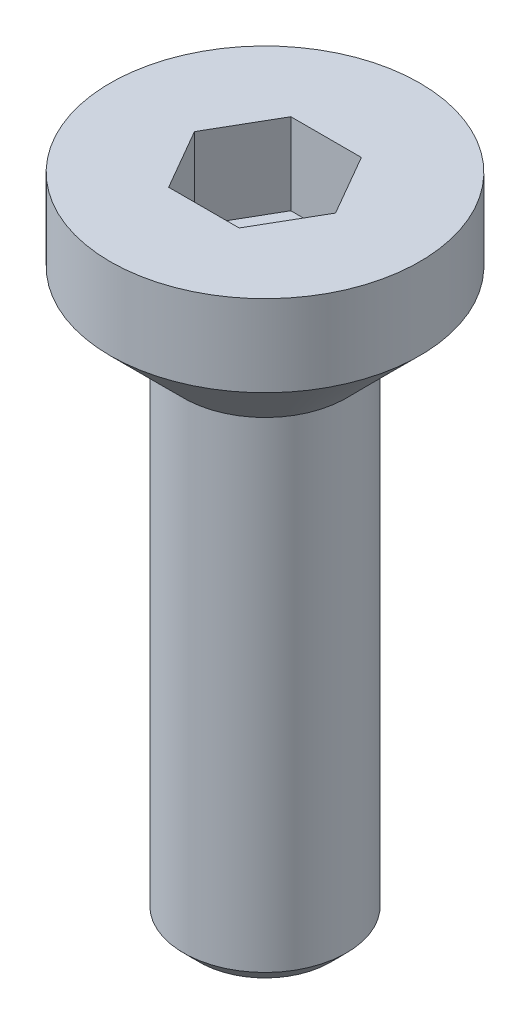
ISO-10303-21;
HEADER;
FILE_DESCRIPTION(('STEP AP214'),'2;1');
FILE_NAME('part.step','',(''),(''),'','','');
FILE_SCHEMA(('AUTOMOTIVE_DESIGN { 1 0 10303 214 1 1 1 1 }'));
ENDSEC;
DATA;
#1=APPLICATION_CONTEXT('core data for automotive mechanical design processes');
#2=APPLICATION_PROTOCOL_DEFINITION('international standard','automotive_design',2000,#1);
#3=PRODUCT_CONTEXT('',#1,'mechanical');
#4=PRODUCT('Part','Part','',(#3));
#5=PRODUCT_RELATED_PRODUCT_CATEGORY('part','',(#4));
#6=PRODUCT_DEFINITION_FORMATION('','',#4);
#7=PRODUCT_DEFINITION_CONTEXT('part definition',#1,'design');
#8=PRODUCT_DEFINITION('design','',#6,#7);
#9=PRODUCT_DEFINITION_SHAPE('','',#8);
#10=(LENGTH_UNIT() NAMED_UNIT(*) SI_UNIT(.MILLI.,.METRE.));
#11=(NAMED_UNIT(*) PLANE_ANGLE_UNIT() SI_UNIT($,.RADIAN.));
#12=(NAMED_UNIT(*) SI_UNIT($,.STERADIAN.) SOLID_ANGLE_UNIT());
#13=UNCERTAINTY_MEASURE_WITH_UNIT(LENGTH_MEASURE(1.E-05),#10,'distance_accuracy_value','');
#14=(GEOMETRIC_REPRESENTATION_CONTEXT(3) GLOBAL_UNCERTAINTY_ASSIGNED_CONTEXT((#13)) GLOBAL_UNIT_ASSIGNED_CONTEXT((#10,
#11,#12)) REPRESENTATION_CONTEXT('',''));
#15=CARTESIAN_POINT('',(0.,0.,0.));
#16=DIRECTION('',(0.,0.,1.));
#17=DIRECTION('',(1.,0.,0.));
#18=AXIS2_PLACEMENT_3D('',#15,#16,#17);
#19=CARTESIAN_POINT('',(0.,3.32965981119297,0.));
#20=DIRECTION('',(0.,-1.,0.));
#21=DIRECTION('',(0.,0.,-1.));
#22=AXIS2_PLACEMENT_3D('',#19,#20,#21);
#23=PLANE('',#22);
#24=DIRECTION('',(1.,0.,0.));
#25=VECTOR('',#24,1.);
#26=CARTESIAN_POINT('',(-0.43301270189222,3.32965981119297,0.75));
#27=LINE('',#26,#25);
#28=CARTESIAN_POINT('',(-0.43301270189222,3.32965981119297,0.75));
#29=VERTEX_POINT('',#28);
#30=CARTESIAN_POINT('',(0.433012701892219,3.32965981119297,0.75));
#31=VERTEX_POINT('',#30);
#32=EDGE_CURVE('E125',#29,#31,#27,.T.);
#33=ORIENTED_EDGE('',*,*,#32,.F.);
#34=DIRECTION('',(0.5,0.,0.866025403784439));
#35=VECTOR('',#34,1.);
#36=CARTESIAN_POINT('',(-0.866025403784439,3.32965981119297,0.));
#37=LINE('',#36,#35);
#38=CARTESIAN_POINT('',(-0.866025403784439,3.32965981119297,0.));
#39=VERTEX_POINT('',#38);
#40=EDGE_CURVE('E51',#39,#29,#37,.T.);
#41=ORIENTED_EDGE('',*,*,#40,.F.);
#42=DIRECTION('',(-0.5,0.,0.866025403784438));
#43=VECTOR('',#42,1.);
#44=CARTESIAN_POINT('',(-0.433012701892219,3.32965981119297,-0.75));
#45=LINE('',#44,#43);
#46=CARTESIAN_POINT('',(-0.433012701892219,3.32965981119297,-0.75));
#47=VERTEX_POINT('',#46);
#48=EDGE_CURVE('E134',#47,#39,#45,.T.);
#49=ORIENTED_EDGE('',*,*,#48,.F.);
#50=DIRECTION('',(-1.,0.,0.));
#51=VECTOR('',#50,1.);
#52=CARTESIAN_POINT('',(0.43301270189222,3.32965981119297,-0.75));
#53=LINE('',#52,#51);
#54=CARTESIAN_POINT('',(0.43301270189222,3.32965981119297,-0.75));
#55=VERTEX_POINT('',#54);
#56=EDGE_CURVE('E132',#55,#47,#53,.T.);
#57=ORIENTED_EDGE('',*,*,#56,.F.);
#58=DIRECTION('',(-0.5,0.,-0.866025403784439));
#59=VECTOR('',#58,1.);
#60=CARTESIAN_POINT('',(0.866025403784439,3.32965981119297,0.));
#61=LINE('',#60,#59);
#62=CARTESIAN_POINT('',(0.866025403784439,3.32965981119297,0.));
#63=VERTEX_POINT('',#62);
#64=EDGE_CURVE('E99',#63,#55,#61,.T.);
#65=ORIENTED_EDGE('',*,*,#64,.F.);
#66=DIRECTION('',(0.5,0.,-0.866025403784439));
#67=VECTOR('',#66,1.);
#68=CARTESIAN_POINT('',(0.433012701892219,3.32965981119297,0.75));
#69=LINE('',#68,#67);
#70=EDGE_CURVE('E128',#31,#63,#69,.T.);
#71=ORIENTED_EDGE('',*,*,#70,.F.);
#72=EDGE_LOOP('',(#33,#41,#49,#57,#65,#71));
#73=FACE_BOUND('',#72,.T.);
#74=CARTESIAN_POINT('',(0.,3.32965981119297,0.));
#75=DIRECTION('',(0.,-1.,0.));
#76=DIRECTION('',(0.,0.,-1.));
#77=AXIS2_PLACEMENT_3D('',#74,#75,#76);
#78=CIRCLE('',#77,1.9);
#79=CARTESIAN_POINT('',(0.,3.32965981119297,-1.9));
#80=VERTEX_POINT('',#79);
#81=EDGE_CURVE('E11',#80,#80,#78,.T.);
#82=ORIENTED_EDGE('',*,*,#81,.F.);
#83=EDGE_LOOP('',(#82));
#84=FACE_BOUND('',#83,.T.);
#85=ADVANCED_FACE('F37',(#73,#84),#23,.F.);
#86=CARTESIAN_POINT('',(0.,-3.76919896922529,0.));
#87=DIRECTION('',(0.,-1.,0.));
#88=DIRECTION('',(0.,0.,-1.));
#89=AXIS2_PLACEMENT_3D('',#86,#87,#88);
#90=CYLINDRICAL_SURFACE('',#89,1.9);
#91=CARTESIAN_POINT('',(0.,2.32965981119296,0.));
#92=DIRECTION('',(0.,-1.,0.));
#93=DIRECTION('',(0.,0.,-1.));
#94=AXIS2_PLACEMENT_3D('',#91,#92,#93);
#95=CIRCLE('',#94,1.9);
#96=CARTESIAN_POINT('',(0.,2.32965981119296,-1.9));
#97=VERTEX_POINT('',#96);
#98=EDGE_CURVE('E44',#97,#97,#95,.T.);
#99=ORIENTED_EDGE('',*,*,#98,.F.);
#100=EDGE_LOOP('',(#99));
#101=FACE_BOUND('',#100,.T.);
#102=ORIENTED_EDGE('',*,*,#81,.T.);
#103=EDGE_LOOP('',(#102));
#104=FACE_BOUND('',#103,.T.);
#105=ADVANCED_FACE('F156',(#101,#104),#90,.T.);
#106=CARTESIAN_POINT('',(0.,2.32965981119296,0.));
#107=DIRECTION('',(0.,1.,0.));
#108=DIRECTION('',(0.,0.,1.));
#109=AXIS2_PLACEMENT_3D('',#106,#107,#108);
#110=CONICAL_SURFACE('',#109,1.9,0.785398163397451);
#111=CARTESIAN_POINT('',(0.,1.42965981119297,0.));
#112=DIRECTION('',(0.,-1.,0.));
#113=DIRECTION('',(0.,0.,-1.));
#114=AXIS2_PLACEMENT_3D('',#111,#112,#113);
#115=CIRCLE('',#114,1.);
#116=CARTESIAN_POINT('',(0.,1.42965981119297,-1.));
#117=VERTEX_POINT('',#116);
#118=EDGE_CURVE('E149',#117,#117,#115,.T.);
#119=ORIENTED_EDGE('',*,*,#118,.F.);
#120=EDGE_LOOP('',(#119));
#121=FACE_BOUND('',#120,.T.);
#122=ORIENTED_EDGE('',*,*,#98,.T.);
#123=EDGE_LOOP('',(#122));
#124=FACE_BOUND('',#123,.T.);
#125=ADVANCED_FACE('F154',(#121,#124),#110,.T.);
#126=CARTESIAN_POINT('',(0.,-3.76919896922529,0.));
#127=DIRECTION('',(0.,-1.,0.));
#128=DIRECTION('',(0.,0.,-1.));
#129=AXIS2_PLACEMENT_3D('',#126,#127,#128);
#130=CYLINDRICAL_SURFACE('',#129,1.);
#131=CARTESIAN_POINT('',(0.,-4.47034018880703,0.));
#132=DIRECTION('',(0.,-1.,0.));
#133=DIRECTION('',(0.,0.,-1.));
#134=AXIS2_PLACEMENT_3D('',#131,#132,#133);
#135=CIRCLE('',#134,0.999999999999999);
#136=CARTESIAN_POINT('',(0.,-4.47034018880703,-0.999999999999999));
#137=VERTEX_POINT('',#136);
#138=EDGE_CURVE('E146',#137,#137,#135,.T.);
#139=ORIENTED_EDGE('',*,*,#138,.F.);
#140=EDGE_LOOP('',(#139));
#141=FACE_BOUND('',#140,.T.);
#142=ORIENTED_EDGE('',*,*,#118,.T.);
#143=EDGE_LOOP('',(#142));
#144=FACE_BOUND('',#143,.T.);
#145=ADVANCED_FACE('F189',(#141,#144),#130,.T.);
#146=CARTESIAN_POINT('',(0.,-4.47034018880703,0.));
#147=DIRECTION('',(0.,1.,0.));
#148=DIRECTION('',(0.,0.,1.));
#149=AXIS2_PLACEMENT_3D('',#146,#147,#148);
#150=CONICAL_SURFACE('',#149,0.999999999999999,0.78539816339745);
#151=CARTESIAN_POINT('',(0.,-4.67034018880703,0.));
#152=DIRECTION('',(0.,-1.,0.));
#153=DIRECTION('',(0.,0.,-1.));
#154=AXIS2_PLACEMENT_3D('',#151,#152,#153);
#155=CIRCLE('',#154,0.8);
#156=CARTESIAN_POINT('',(0.,-4.67034018880703,-0.8));
#157=VERTEX_POINT('',#156);
#158=EDGE_CURVE('E138',#157,#157,#155,.T.);
#159=ORIENTED_EDGE('',*,*,#158,.F.);
#160=EDGE_LOOP('',(#159));
#161=FACE_BOUND('',#160,.T.);
#162=ORIENTED_EDGE('',*,*,#138,.T.);
#163=EDGE_LOOP('',(#162));
#164=FACE_BOUND('',#163,.T.);
#165=ADVANCED_FACE('F181',(#161,#164),#150,.T.);
#166=CARTESIAN_POINT('',(-0.8,-4.67034018880703,0.));
#167=DIRECTION('',(0.,1.,0.));
#168=DIRECTION('',(0.,0.,1.));
#169=AXIS2_PLACEMENT_3D('',#166,#167,#168);
#170=PLANE('',#169);
#171=ORIENTED_EDGE('',*,*,#158,.T.);
#172=EDGE_LOOP('',(#171));
#173=FACE_BOUND('',#172,.T.);
#174=ADVANCED_FACE('F174',(#173),#170,.F.);
#175=CARTESIAN_POINT('',(-0.866025403784439,2.32965981119297,0.));
#176=DIRECTION('',(-0.866025403784439,0.,0.5));
#177=DIRECTION('',(0.5,0.,0.866025403784439));
#178=AXIS2_PLACEMENT_3D('',#175,#176,#177);
#179=PLANE('',#178);
#180=ORIENTED_EDGE('',*,*,#40,.T.);
#181=DIRECTION('',(0.,1.,0.));
#182=VECTOR('',#181,1.);
#183=CARTESIAN_POINT('',(-0.43301270189222,2.32965981119297,0.75));
#184=LINE('',#183,#182);
#185=CARTESIAN_POINT('',(-0.43301270189222,2.32965981119297,0.75));
#186=VERTEX_POINT('',#185);
#187=EDGE_CURVE('E81',#186,#29,#184,.T.);
#188=ORIENTED_EDGE('',*,*,#187,.F.);
#189=DIRECTION('',(0.5,0.,0.866025403784439));
#190=VECTOR('',#189,1.);
#191=CARTESIAN_POINT('',(-0.866025403784439,2.32965981119297,0.));
#192=LINE('',#191,#190);
#193=CARTESIAN_POINT('',(-0.866025403784439,2.32965981119297,0.));
#194=VERTEX_POINT('',#193);
#195=EDGE_CURVE('E136',#194,#186,#192,.T.);
#196=ORIENTED_EDGE('',*,*,#195,.F.);
#197=DIRECTION('',(0.,1.,0.));
#198=VECTOR('',#197,1.);
#199=CARTESIAN_POINT('',(-0.866025403784439,2.32965981119297,0.));
#200=LINE('',#199,#198);
#201=EDGE_CURVE('E59',#194,#39,#200,.T.);
#202=ORIENTED_EDGE('',*,*,#201,.T.);
#203=EDGE_LOOP('',(#180,#188,#196,#202));
#204=FACE_BOUND('',#203,.T.);
#205=ADVANCED_FACE('F171',(#204),#179,.F.);
#206=CARTESIAN_POINT('',(-0.433012701892219,2.32965981119297,-0.75));
#207=DIRECTION('',(-0.866025403784439,0.,-0.5));
#208=DIRECTION('',(-0.5,0.,0.866025403784438));
#209=AXIS2_PLACEMENT_3D('',#206,#207,#208);
#210=PLANE('',#209);
#211=ORIENTED_EDGE('',*,*,#48,.T.);
#212=ORIENTED_EDGE('',*,*,#201,.F.);
#213=DIRECTION('',(-0.5,0.,0.866025403784438));
#214=VECTOR('',#213,1.);
#215=CARTESIAN_POINT('',(-0.433012701892219,2.32965981119297,-0.75));
#216=LINE('',#215,#214);
#217=CARTESIAN_POINT('',(-0.433012701892219,2.32965981119297,-0.75));
#218=VERTEX_POINT('',#217);
#219=EDGE_CURVE('E111',#218,#194,#216,.T.);
#220=ORIENTED_EDGE('',*,*,#219,.F.);
#221=DIRECTION('',(0.,1.,0.));
#222=VECTOR('',#221,1.);
#223=CARTESIAN_POINT('',(-0.433012701892219,2.32965981119297,-0.75));
#224=LINE('',#223,#222);
#225=EDGE_CURVE('E103',#218,#47,#224,.T.);
#226=ORIENTED_EDGE('',*,*,#225,.T.);
#227=EDGE_LOOP('',(#211,#212,#220,#226));
#228=FACE_BOUND('',#227,.T.);
#229=ADVANCED_FACE('F173',(#228),#210,.F.);
#230=CARTESIAN_POINT('',(0.43301270189222,2.32965981119297,-0.75));
#231=DIRECTION('',(0.,0.,-1.));
#232=DIRECTION('',(-1.,0.,0.));
#233=AXIS2_PLACEMENT_3D('',#230,#231,#232);
#234=PLANE('',#233);
#235=ORIENTED_EDGE('',*,*,#56,.T.);
#236=ORIENTED_EDGE('',*,*,#225,.F.);
#237=DIRECTION('',(-1.,0.,0.));
#238=VECTOR('',#237,1.);
#239=CARTESIAN_POINT('',(0.43301270189222,2.32965981119297,-0.75));
#240=LINE('',#239,#238);
#241=CARTESIAN_POINT('',(0.43301270189222,2.32965981119297,-0.75));
#242=VERTEX_POINT('',#241);
#243=EDGE_CURVE('E107',#242,#218,#240,.T.);
#244=ORIENTED_EDGE('',*,*,#243,.F.);
#245=DIRECTION('',(0.,1.,0.));
#246=VECTOR('',#245,1.);
#247=CARTESIAN_POINT('',(0.43301270189222,2.32965981119297,-0.75));
#248=LINE('',#247,#246);
#249=EDGE_CURVE('E92',#242,#55,#248,.T.);
#250=ORIENTED_EDGE('',*,*,#249,.T.);
#251=EDGE_LOOP('',(#235,#236,#244,#250));
#252=FACE_BOUND('',#251,.T.);
#253=ADVANCED_FACE('F108',(#252),#234,.F.);
#254=CARTESIAN_POINT('',(0.866025403784439,2.32965981119297,0.));
#255=DIRECTION('',(0.866025403784439,0.,-0.5));
#256=DIRECTION('',(-0.5,0.,-0.866025403784439));
#257=AXIS2_PLACEMENT_3D('',#254,#255,#256);
#258=PLANE('',#257);
#259=ORIENTED_EDGE('',*,*,#64,.T.);
#260=ORIENTED_EDGE('',*,*,#249,.F.);
#261=DIRECTION('',(-0.5,0.,-0.866025403784439));
#262=VECTOR('',#261,1.);
#263=CARTESIAN_POINT('',(0.866025403784439,2.32965981119297,0.));
#264=LINE('',#263,#262);
#265=CARTESIAN_POINT('',(0.866025403784439,2.32965981119297,0.));
#266=VERTEX_POINT('',#265);
#267=EDGE_CURVE('E96',#266,#242,#264,.T.);
#268=ORIENTED_EDGE('',*,*,#267,.F.);
#269=DIRECTION('',(0.,1.,0.));
#270=VECTOR('',#269,1.);
#271=CARTESIAN_POINT('',(0.866025403784439,2.32965981119297,0.));
#272=LINE('',#271,#270);
#273=EDGE_CURVE('E104',#266,#63,#272,.T.);
#274=ORIENTED_EDGE('',*,*,#273,.T.);
#275=EDGE_LOOP('',(#259,#260,#268,#274));
#276=FACE_BOUND('',#275,.T.);
#277=ADVANCED_FACE('F94',(#276),#258,.F.);
#278=CARTESIAN_POINT('',(0.433012701892219,2.32965981119297,0.75));
#279=DIRECTION('',(0.866025403784439,0.,0.5));
#280=DIRECTION('',(0.5,0.,-0.866025403784439));
#281=AXIS2_PLACEMENT_3D('',#278,#279,#280);
#282=PLANE('',#281);
#283=ORIENTED_EDGE('',*,*,#70,.T.);
#284=ORIENTED_EDGE('',*,*,#273,.F.);
#285=DIRECTION('',(0.5,0.,-0.866025403784439));
#286=VECTOR('',#285,1.);
#287=CARTESIAN_POINT('',(0.433012701892219,2.32965981119297,0.75));
#288=LINE('',#287,#286);
#289=CARTESIAN_POINT('',(0.433012701892219,2.32965981119297,0.75));
#290=VERTEX_POINT('',#289);
#291=EDGE_CURVE('E117',#290,#266,#288,.T.);
#292=ORIENTED_EDGE('',*,*,#291,.F.);
#293=DIRECTION('',(0.,1.,0.));
#294=VECTOR('',#293,1.);
#295=CARTESIAN_POINT('',(0.433012701892219,2.32965981119297,0.75));
#296=LINE('',#295,#294);
#297=EDGE_CURVE('E141',#290,#31,#296,.T.);
#298=ORIENTED_EDGE('',*,*,#297,.T.);
#299=EDGE_LOOP('',(#283,#284,#292,#298));
#300=FACE_BOUND('',#299,.T.);
#301=ADVANCED_FACE('F246',(#300),#282,.F.);
#302=CARTESIAN_POINT('',(-0.43301270189222,2.32965981119297,0.75));
#303=DIRECTION('',(0.,0.,1.));
#304=DIRECTION('',(1.,0.,0.));
#305=AXIS2_PLACEMENT_3D('',#302,#303,#304);
#306=PLANE('',#305);
#307=ORIENTED_EDGE('',*,*,#32,.T.);
#308=ORIENTED_EDGE('',*,*,#297,.F.);
#309=DIRECTION('',(1.,0.,0.));
#310=VECTOR('',#309,1.);
#311=CARTESIAN_POINT('',(-0.43301270189222,2.32965981119297,0.75));
#312=LINE('',#311,#310);
#313=EDGE_CURVE('E119',#186,#290,#312,.T.);
#314=ORIENTED_EDGE('',*,*,#313,.F.);
#315=ORIENTED_EDGE('',*,*,#187,.T.);
#316=EDGE_LOOP('',(#307,#308,#314,#315));
#317=FACE_BOUND('',#316,.T.);
#318=ADVANCED_FACE('F169',(#317),#306,.F.);
#319=CARTESIAN_POINT('',(0.,2.32965981119297,0.));
#320=DIRECTION('',(0.,1.,0.));
#321=DIRECTION('',(0.,0.,1.));
#322=AXIS2_PLACEMENT_3D('',#319,#320,#321);
#323=PLANE('',#322);
#324=ORIENTED_EDGE('',*,*,#195,.T.);
#325=ORIENTED_EDGE('',*,*,#313,.T.);
#326=ORIENTED_EDGE('',*,*,#291,.T.);
#327=ORIENTED_EDGE('',*,*,#267,.T.);
#328=ORIENTED_EDGE('',*,*,#243,.T.);
#329=ORIENTED_EDGE('',*,*,#219,.T.);
#330=EDGE_LOOP('',(#324,#325,#326,#327,#328,#329));
#331=FACE_BOUND('',#330,.T.);
#332=ADVANCED_FACE('F114',(#331),#323,.T.);
#333=CLOSED_SHELL('',(#85,#105,#125,#145,#165,#174,#205,#229,#253,#277,#301,#318,#332));
#334=MANIFOLD_SOLID_BREP('B2',#333);
#335=ADVANCED_BREP_SHAPE_REPRESENTATION('',(#18,#334),#14);
#336=SHAPE_DEFINITION_REPRESENTATION(#9,#335);
ENDSEC;
END-ISO-10303-21;
